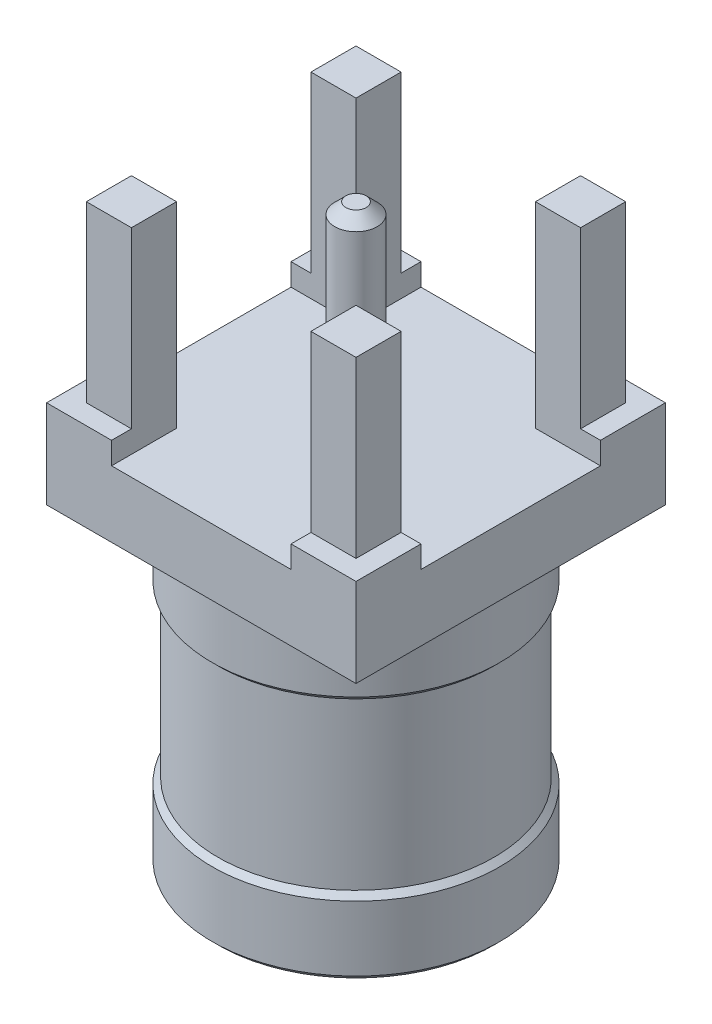
ISO-10303-21;
HEADER;
FILE_DESCRIPTION(('STEP AP214'),'2;1');
FILE_NAME('part.step','',(''),(''),'','','');
FILE_SCHEMA(('AUTOMOTIVE_DESIGN { 1 0 10303 214 1 1 1 1 }'));
ENDSEC;
DATA;
#1=APPLICATION_CONTEXT('core data for automotive mechanical design processes');
#2=APPLICATION_PROTOCOL_DEFINITION('international standard','automotive_design',2000,#1);
#3=PRODUCT_CONTEXT('',#1,'mechanical');
#4=PRODUCT('Part','Part','',(#3));
#5=PRODUCT_RELATED_PRODUCT_CATEGORY('part','',(#4));
#6=PRODUCT_DEFINITION_FORMATION('','',#4);
#7=PRODUCT_DEFINITION_CONTEXT('part definition',#1,'design');
#8=PRODUCT_DEFINITION('design','',#6,#7);
#9=PRODUCT_DEFINITION_SHAPE('','',#8);
#10=(LENGTH_UNIT() NAMED_UNIT(*) SI_UNIT(.MILLI.,.METRE.));
#11=(NAMED_UNIT(*) PLANE_ANGLE_UNIT() SI_UNIT($,.RADIAN.));
#12=(NAMED_UNIT(*) SI_UNIT($,.STERADIAN.) SOLID_ANGLE_UNIT());
#13=UNCERTAINTY_MEASURE_WITH_UNIT(LENGTH_MEASURE(1.E-05),#10,'distance_accuracy_value','');
#14=(GEOMETRIC_REPRESENTATION_CONTEXT(3) GLOBAL_UNCERTAINTY_ASSIGNED_CONTEXT((#13)) GLOBAL_UNIT_ASSIGNED_CONTEXT((#10,
#11,#12)) REPRESENTATION_CONTEXT('',''));
#15=CARTESIAN_POINT('',(0.,0.,0.));
#16=DIRECTION('',(0.,0.,1.));
#17=DIRECTION('',(1.,0.,0.));
#18=AXIS2_PLACEMENT_3D('',#15,#16,#17);
#19=CARTESIAN_POINT('',(0.,-25.3123881554251,0.));
#20=DIRECTION('',(0.,1.,0.));
#21=DIRECTION('',(0.,0.,1.));
#22=AXIS2_PLACEMENT_3D('',#19,#20,#21);
#23=CYLINDRICAL_SURFACE('',#22,3.25);
#24=CARTESIAN_POINT('',(0.,-1.4675,0.));
#25=DIRECTION('',(0.,-1.,0.));
#26=DIRECTION('',(0.,0.,-1.));
#27=AXIS2_PLACEMENT_3D('',#24,#25,#26);
#28=CIRCLE('',#27,3.25);
#29=CARTESIAN_POINT('',(0.,-1.4675,-3.25));
#30=VERTEX_POINT('',#29);
#31=EDGE_CURVE('E1028',#30,#30,#28,.T.);
#32=ORIENTED_EDGE('',*,*,#31,.F.);
#33=EDGE_LOOP('',(#32));
#34=FACE_BOUND('',#33,.T.);
#35=CARTESIAN_POINT('',(0.,-0.125000000000002,0.));
#36=DIRECTION('',(0.,-1.,0.));
#37=DIRECTION('',(0.,0.,-1.));
#38=AXIS2_PLACEMENT_3D('',#35,#36,#37);
#39=CIRCLE('',#38,3.25);
#40=CARTESIAN_POINT('',(0.,-0.125000000000002,-3.25));
#41=VERTEX_POINT('',#40);
#42=EDGE_CURVE('E1011',#41,#41,#39,.T.);
#43=ORIENTED_EDGE('',*,*,#42,.T.);
#44=EDGE_LOOP('',(#43));
#45=FACE_BOUND('',#44,.T.);
#46=ADVANCED_FACE('F40',(#34,#45),#23,.T.);
#47=CARTESIAN_POINT('',(0.,-6.935,0.));
#48=DIRECTION('',(0.,-1.,0.));
#49=DIRECTION('',(0.,0.,-1.));
#50=AXIS2_PLACEMENT_3D('',#47,#48,#49);
#51=CIRCLE('',#50,3.25);
#52=CARTESIAN_POINT('',(0.,-6.935,-3.25));
#53=VERTEX_POINT('',#52);
#54=EDGE_CURVE('E519',#53,#53,#51,.F.);
#55=ORIENTED_EDGE('',*,*,#54,.T.);
#56=EDGE_LOOP('',(#55));
#57=FACE_BOUND('',#56,.T.);
#58=CARTESIAN_POINT('',(0.,-5.4675,0.));
#59=DIRECTION('',(0.,-1.,0.));
#60=DIRECTION('',(0.,0.,-1.));
#61=AXIS2_PLACEMENT_3D('',#58,#59,#60);
#62=CIRCLE('',#61,3.25);
#63=CARTESIAN_POINT('',(0.,-5.4675,-3.25));
#64=VERTEX_POINT('',#63);
#65=EDGE_CURVE('E1016',#64,#64,#62,.T.);
#66=ORIENTED_EDGE('',*,*,#65,.T.);
#67=EDGE_LOOP('',(#66));
#68=FACE_BOUND('',#67,.T.);
#69=ADVANCED_FACE('F540',(#57,#68),#23,.T.);
#70=CARTESIAN_POINT('',(0.,-25.3123881554251,0.));
#71=DIRECTION('',(0.,1.,0.));
#72=DIRECTION('',(0.,0.,1.));
#73=AXIS2_PLACEMENT_3D('',#70,#71,#72);
#74=CYLINDRICAL_SURFACE('',#73,1.6);
#75=CARTESIAN_POINT('',(0.,-6.935,0.));
#76=DIRECTION('',(0.,-1.,0.));
#77=DIRECTION('',(0.,0.,-1.));
#78=AXIS2_PLACEMENT_3D('',#75,#76,#77);
#79=CIRCLE('',#78,1.6);
#80=CARTESIAN_POINT('',(0.,-6.935,-1.6));
#81=VERTEX_POINT('',#80);
#82=EDGE_CURVE('E506',#81,#81,#79,.T.);
#83=ORIENTED_EDGE('',*,*,#82,.T.);
#84=EDGE_LOOP('',(#83));
#85=FACE_BOUND('',#84,.T.);
#86=CARTESIAN_POINT('',(0.,0.,0.));
#87=DIRECTION('',(0.,-1.,0.));
#88=DIRECTION('',(0.,0.,-1.));
#89=AXIS2_PLACEMENT_3D('',#86,#87,#88);
#90=CIRCLE('',#89,1.6);
#91=CARTESIAN_POINT('',(0.,0.,-1.6));
#92=VERTEX_POINT('',#91);
#93=EDGE_CURVE('E437',#92,#92,#90,.F.);
#94=ORIENTED_EDGE('',*,*,#93,.T.);
#95=EDGE_LOOP('',(#94));
#96=FACE_BOUND('',#95,.T.);
#97=ADVANCED_FACE('F547',(#85,#96),#74,.F.);
#98=CARTESIAN_POINT('',(0.,-7.06,0.));
#99=DIRECTION('',(0.,-1.,0.));
#100=DIRECTION('',(0.,0.,-1.));
#101=AXIS2_PLACEMENT_3D('',#98,#99,#100);
#102=PLANE('',#101);
#103=CARTESIAN_POINT('',(0.,-7.06,0.));
#104=DIRECTION('',(0.,-1.,0.));
#105=DIRECTION('',(0.,0.,-1.));
#106=AXIS2_PLACEMENT_3D('',#103,#104,#105);
#107=CIRCLE('',#106,1.72500000000001);
#108=CARTESIAN_POINT('',(0.,-7.06,-1.72500000000001));
#109=VERTEX_POINT('',#108);
#110=EDGE_CURVE('E514',#109,#109,#107,.F.);
#111=ORIENTED_EDGE('',*,*,#110,.T.);
#112=EDGE_LOOP('',(#111));
#113=FACE_BOUND('',#112,.T.);
#114=CARTESIAN_POINT('',(0.,-7.06,0.));
#115=DIRECTION('',(0.,-1.,0.));
#116=DIRECTION('',(0.,0.,-1.));
#117=AXIS2_PLACEMENT_3D('',#114,#115,#116);
#118=CIRCLE('',#117,3.125);
#119=CARTESIAN_POINT('',(0.,-7.06,-3.125));
#120=VERTEX_POINT('',#119);
#121=EDGE_CURVE('E510',#120,#120,#118,.T.);
#122=ORIENTED_EDGE('',*,*,#121,.T.);
#123=EDGE_LOOP('',(#122));
#124=FACE_BOUND('',#123,.T.);
#125=ADVANCED_FACE('F671',(#113,#124),#102,.T.);
#126=CARTESIAN_POINT('',(0.,0.,0.));
#127=DIRECTION('',(0.,-1.,0.));
#128=DIRECTION('',(0.,0.,-1.));
#129=AXIS2_PLACEMENT_3D('',#126,#127,#128);
#130=PLANE('',#129);
#131=ORIENTED_EDGE('',*,*,#93,.F.);
#132=EDGE_LOOP('',(#131));
#133=FACE_BOUND('',#132,.T.);
#134=ADVANCED_FACE('F645',(#133),#130,.T.);
#135=CARTESIAN_POINT('',(0.,-6.935,0.));
#136=DIRECTION('',(0.,-1.,0.));
#137=DIRECTION('',(0.,0.,-1.));
#138=AXIS2_PLACEMENT_3D('',#135,#136,#137);
#139=CONICAL_SURFACE('',#138,1.6,0.785398163397458);
#140=ORIENTED_EDGE('',*,*,#110,.F.);
#141=EDGE_LOOP('',(#140));
#142=FACE_BOUND('',#141,.T.);
#143=ORIENTED_EDGE('',*,*,#82,.F.);
#144=EDGE_LOOP('',(#143));
#145=FACE_BOUND('',#144,.T.);
#146=ADVANCED_FACE('F654',(#142,#145),#139,.F.);
#147=CARTESIAN_POINT('',(0.,-7.06,0.));
#148=DIRECTION('',(0.,1.,0.));
#149=DIRECTION('',(0.,0.,1.));
#150=AXIS2_PLACEMENT_3D('',#147,#148,#149);
#151=CONICAL_SURFACE('',#150,3.125,0.785398163397445);
#152=ORIENTED_EDGE('',*,*,#54,.F.);
#153=EDGE_LOOP('',(#152));
#154=FACE_BOUND('',#153,.T.);
#155=ORIENTED_EDGE('',*,*,#121,.F.);
#156=EDGE_LOOP('',(#155));
#157=FACE_BOUND('',#156,.T.);
#158=ADVANCED_FACE('F656',(#154,#157),#151,.T.);
#159=CARTESIAN_POINT('',(0.,-1.5925,0.));
#160=DIRECTION('',(0.,1.,0.));
#161=DIRECTION('',(0.,0.,1.));
#162=AXIS2_PLACEMENT_3D('',#159,#160,#161);
#163=CONICAL_SURFACE('',#162,3.125,0.785398163397459);
#164=ORIENTED_EDGE('',*,*,#31,.T.);
#165=EDGE_LOOP('',(#164));
#166=FACE_BOUND('',#165,.T.);
#167=CARTESIAN_POINT('',(0.,-1.5925,0.));
#168=DIRECTION('',(0.,-1.,0.));
#169=DIRECTION('',(0.,0.,-1.));
#170=AXIS2_PLACEMENT_3D('',#167,#168,#169);
#171=CIRCLE('',#170,3.125);
#172=CARTESIAN_POINT('',(0.,-1.5925,-3.125));
#173=VERTEX_POINT('',#172);
#174=EDGE_CURVE('E1024',#173,#173,#171,.T.);
#175=ORIENTED_EDGE('',*,*,#174,.F.);
#176=EDGE_LOOP('',(#175));
#177=FACE_BOUND('',#176,.T.);
#178=ADVANCED_FACE('F659',(#166,#177),#163,.T.);
#179=CARTESIAN_POINT('',(0.,-6.81,0.));
#180=DIRECTION('',(0.,-1.,0.));
#181=DIRECTION('',(0.,0.,-1.));
#182=AXIS2_PLACEMENT_3D('',#179,#180,#181);
#183=CYLINDRICAL_SURFACE('',#182,3.125);
#184=ORIENTED_EDGE('',*,*,#174,.T.);
#185=EDGE_LOOP('',(#184));
#186=FACE_BOUND('',#185,.T.);
#187=CARTESIAN_POINT('',(0.,-5.3425,0.));
#188=DIRECTION('',(0.,-1.,0.));
#189=DIRECTION('',(0.,0.,-1.));
#190=AXIS2_PLACEMENT_3D('',#187,#188,#189);
#191=CIRCLE('',#190,3.125);
#192=CARTESIAN_POINT('',(0.,-5.3425,-3.125));
#193=VERTEX_POINT('',#192);
#194=EDGE_CURVE('E1021',#193,#193,#191,.T.);
#195=ORIENTED_EDGE('',*,*,#194,.F.);
#196=EDGE_LOOP('',(#195));
#197=FACE_BOUND('',#196,.T.);
#198=ADVANCED_FACE('F664',(#186,#197),#183,.T.);
#199=CARTESIAN_POINT('',(0.,-5.4675,0.));
#200=DIRECTION('',(0.,-1.,0.));
#201=DIRECTION('',(0.,0.,-1.));
#202=AXIS2_PLACEMENT_3D('',#199,#200,#201);
#203=CONICAL_SURFACE('',#202,3.25,0.785398163397434);
#204=ORIENTED_EDGE('',*,*,#194,.T.);
#205=EDGE_LOOP('',(#204));
#206=FACE_BOUND('',#205,.T.);
#207=ORIENTED_EDGE('',*,*,#65,.F.);
#208=EDGE_LOOP('',(#207));
#209=FACE_BOUND('',#208,.T.);
#210=ADVANCED_FACE('F682',(#206,#209),#203,.T.);
#211=CARTESIAN_POINT('',(0.,-0.125000000000002,0.));
#212=DIRECTION('',(0.,-1.,0.));
#213=DIRECTION('',(0.,0.,-1.));
#214=AXIS2_PLACEMENT_3D('',#211,#212,#213);
#215=CONICAL_SURFACE('',#214,3.25,0.785398163397442);
#216=CARTESIAN_POINT('',(0.,0.,0.));
#217=DIRECTION('',(0.,-1.,0.));
#218=DIRECTION('',(0.,0.,-1.));
#219=AXIS2_PLACEMENT_3D('',#216,#217,#218);
#220=CIRCLE('',#219,3.125);
#221=CARTESIAN_POINT('',(0.,0.,-3.125));
#222=VERTEX_POINT('',#221);
#223=EDGE_CURVE('E1008',#222,#222,#220,.T.);
#224=ORIENTED_EDGE('',*,*,#223,.T.);
#225=EDGE_LOOP('',(#224));
#226=FACE_BOUND('',#225,.T.);
#227=ORIENTED_EDGE('',*,*,#42,.F.);
#228=EDGE_LOOP('',(#227));
#229=FACE_BOUND('',#228,.T.);
#230=ADVANCED_FACE('F563',(#226,#229),#215,.T.);
#231=CARTESIAN_POINT('',(-2.03,5.94,-3.05));
#232=DIRECTION('',(0.,0.,1.));
#233=DIRECTION('',(1.,0.,0.));
#234=AXIS2_PLACEMENT_3D('',#231,#232,#233);
#235=PLANE('',#234);
#236=DIRECTION('',(-1.,0.,0.));
#237=VECTOR('',#236,1.);
#238=CARTESIAN_POINT('',(-2.03,2.,-3.05));
#239=LINE('',#238,#237);
#240=CARTESIAN_POINT('',(-2.03,2.,-3.05));
#241=VERTEX_POINT('',#240);
#242=CARTESIAN_POINT('',(-3.05,2.,-3.05));
#243=VERTEX_POINT('',#242);
#244=EDGE_CURVE('E59',#241,#243,#239,.T.);
#245=ORIENTED_EDGE('',*,*,#244,.T.);
#246=DIRECTION('',(0.,-1.,0.));
#247=VECTOR('',#246,1.);
#248=CARTESIAN_POINT('',(-3.05,5.94,-3.05));
#249=LINE('',#248,#247);
#250=CARTESIAN_POINT('',(-3.05,5.94,-3.05));
#251=VERTEX_POINT('',#250);
#252=EDGE_CURVE('E231',#251,#243,#249,.T.);
#253=ORIENTED_EDGE('',*,*,#252,.F.);
#254=DIRECTION('',(-1.,0.,0.));
#255=VECTOR('',#254,1.);
#256=CARTESIAN_POINT('',(-2.03,5.94,-3.05));
#257=LINE('',#256,#255);
#258=CARTESIAN_POINT('',(-2.03,5.94,-3.05));
#259=VERTEX_POINT('',#258);
#260=EDGE_CURVE('E225',#259,#251,#257,.T.);
#261=ORIENTED_EDGE('',*,*,#260,.F.);
#262=DIRECTION('',(0.,-1.,0.));
#263=VECTOR('',#262,1.);
#264=CARTESIAN_POINT('',(-2.03,5.94,-3.05));
#265=LINE('',#264,#263);
#266=EDGE_CURVE('E229',#259,#241,#265,.T.);
#267=ORIENTED_EDGE('',*,*,#266,.T.);
#268=EDGE_LOOP('',(#245,#253,#261,#267));
#269=FACE_BOUND('',#268,.T.);
#270=ADVANCED_FACE('F227',(#269),#235,.F.);
#271=CARTESIAN_POINT('',(-3.05,5.94,-2.03));
#272=DIRECTION('',(1.,0.,0.));
#273=DIRECTION('',(0.,0.,-1.));
#274=AXIS2_PLACEMENT_3D('',#271,#272,#273);
#275=PLANE('',#274);
#276=DIRECTION('',(0.,0.,1.));
#277=VECTOR('',#276,1.);
#278=CARTESIAN_POINT('',(-3.05,2.,-2.03));
#279=LINE('',#278,#277);
#280=CARTESIAN_POINT('',(-3.05,2.,-2.03));
#281=VERTEX_POINT('',#280);
#282=EDGE_CURVE('E55',#243,#281,#279,.T.);
#283=ORIENTED_EDGE('',*,*,#282,.T.);
#284=DIRECTION('',(0.,-1.,0.));
#285=VECTOR('',#284,1.);
#286=CARTESIAN_POINT('',(-3.05,5.94,-2.03));
#287=LINE('',#286,#285);
#288=CARTESIAN_POINT('',(-3.05,5.94,-2.03));
#289=VERTEX_POINT('',#288);
#290=EDGE_CURVE('E254',#289,#281,#287,.T.);
#291=ORIENTED_EDGE('',*,*,#290,.F.);
#292=DIRECTION('',(0.,0.,1.));
#293=VECTOR('',#292,1.);
#294=CARTESIAN_POINT('',(-3.05,5.94,-2.03));
#295=LINE('',#294,#293);
#296=EDGE_CURVE('E234',#251,#289,#295,.T.);
#297=ORIENTED_EDGE('',*,*,#296,.F.);
#298=ORIENTED_EDGE('',*,*,#252,.T.);
#299=EDGE_LOOP('',(#283,#291,#297,#298));
#300=FACE_BOUND('',#299,.T.);
#301=ADVANCED_FACE('F557',(#300),#275,.F.);
#302=CARTESIAN_POINT('',(0.,5.94,0.));
#303=DIRECTION('',(0.,1.,0.));
#304=DIRECTION('',(0.,0.,1.));
#305=AXIS2_PLACEMENT_3D('',#302,#303,#304);
#306=PLANE('',#305);
#307=DIRECTION('',(0.,0.,-1.));
#308=VECTOR('',#307,1.);
#309=CARTESIAN_POINT('',(-2.03,5.94,-2.03));
#310=LINE('',#309,#308);
#311=CARTESIAN_POINT('',(-2.03,5.94,-2.03));
#312=VERTEX_POINT('',#311);
#313=EDGE_CURVE('E235',#312,#259,#310,.T.);
#314=ORIENTED_EDGE('',*,*,#313,.T.);
#315=ORIENTED_EDGE('',*,*,#260,.T.);
#316=ORIENTED_EDGE('',*,*,#296,.T.);
#317=DIRECTION('',(1.,0.,0.));
#318=VECTOR('',#317,1.);
#319=CARTESIAN_POINT('',(-2.03,5.94,-2.03));
#320=LINE('',#319,#318);
#321=EDGE_CURVE('E241',#289,#312,#320,.T.);
#322=ORIENTED_EDGE('',*,*,#321,.T.);
#323=EDGE_LOOP('',(#314,#315,#316,#322));
#324=FACE_BOUND('',#323,.T.);
#325=ADVANCED_FACE('F239',(#324),#306,.T.);
#326=CARTESIAN_POINT('',(-3.05,5.94,2.03));
#327=DIRECTION('',(1.,0.,0.));
#328=DIRECTION('',(0.,0.,-1.));
#329=AXIS2_PLACEMENT_3D('',#326,#327,#328);
#330=PLANE('',#329);
#331=DIRECTION('',(0.,0.,1.));
#332=VECTOR('',#331,1.);
#333=CARTESIAN_POINT('',(-3.05,2.,2.03));
#334=LINE('',#333,#332);
#335=CARTESIAN_POINT('',(-3.05,2.,2.03));
#336=VERTEX_POINT('',#335);
#337=CARTESIAN_POINT('',(-3.05,2.,3.05));
#338=VERTEX_POINT('',#337);
#339=EDGE_CURVE('E309',#336,#338,#334,.T.);
#340=ORIENTED_EDGE('',*,*,#339,.T.);
#341=DIRECTION('',(0.,-1.,0.));
#342=VECTOR('',#341,1.);
#343=CARTESIAN_POINT('',(-3.05,5.94,3.05));
#344=LINE('',#343,#342);
#345=CARTESIAN_POINT('',(-3.05,5.94,3.05));
#346=VERTEX_POINT('',#345);
#347=EDGE_CURVE('E327',#346,#338,#344,.T.);
#348=ORIENTED_EDGE('',*,*,#347,.F.);
#349=DIRECTION('',(0.,0.,1.));
#350=VECTOR('',#349,1.);
#351=CARTESIAN_POINT('',(-3.05,5.94,2.03));
#352=LINE('',#351,#350);
#353=CARTESIAN_POINT('',(-3.05,5.94,2.03));
#354=VERTEX_POINT('',#353);
#355=EDGE_CURVE('E316',#354,#346,#352,.T.);
#356=ORIENTED_EDGE('',*,*,#355,.F.);
#357=DIRECTION('',(0.,-1.,0.));
#358=VECTOR('',#357,1.);
#359=CARTESIAN_POINT('',(-3.05,5.94,2.03));
#360=LINE('',#359,#358);
#361=EDGE_CURVE('E330',#354,#336,#360,.T.);
#362=ORIENTED_EDGE('',*,*,#361,.T.);
#363=EDGE_LOOP('',(#340,#348,#356,#362));
#364=FACE_BOUND('',#363,.T.);
#365=ADVANCED_FACE('F556',(#364),#330,.F.);
#366=CARTESIAN_POINT('',(-2.03,5.94,3.05));
#367=DIRECTION('',(0.,0.,-1.));
#368=DIRECTION('',(-1.,0.,0.));
#369=AXIS2_PLACEMENT_3D('',#366,#367,#368);
#370=PLANE('',#369);
#371=DIRECTION('',(1.,0.,0.));
#372=VECTOR('',#371,1.);
#373=CARTESIAN_POINT('',(-2.03,2.,3.05));
#374=LINE('',#373,#372);
#375=CARTESIAN_POINT('',(-2.03,2.,3.05));
#376=VERTEX_POINT('',#375);
#377=EDGE_CURVE('E314',#338,#376,#374,.T.);
#378=ORIENTED_EDGE('',*,*,#377,.T.);
#379=DIRECTION('',(0.,-1.,0.));
#380=VECTOR('',#379,1.);
#381=CARTESIAN_POINT('',(-2.03,5.94,3.05));
#382=LINE('',#381,#380);
#383=CARTESIAN_POINT('',(-2.03,5.94,3.05));
#384=VERTEX_POINT('',#383);
#385=EDGE_CURVE('E320',#384,#376,#382,.T.);
#386=ORIENTED_EDGE('',*,*,#385,.F.);
#387=DIRECTION('',(1.,0.,0.));
#388=VECTOR('',#387,1.);
#389=CARTESIAN_POINT('',(-2.03,5.94,3.05));
#390=LINE('',#389,#388);
#391=EDGE_CURVE('E318',#346,#384,#390,.T.);
#392=ORIENTED_EDGE('',*,*,#391,.F.);
#393=ORIENTED_EDGE('',*,*,#347,.T.);
#394=EDGE_LOOP('',(#378,#386,#392,#393));
#395=FACE_BOUND('',#394,.T.);
#396=ADVANCED_FACE('F592',(#395),#370,.F.);
#397=CARTESIAN_POINT('',(0.,5.94,0.));
#398=DIRECTION('',(0.,-1.,0.));
#399=DIRECTION('',(0.,0.,-1.));
#400=AXIS2_PLACEMENT_3D('',#397,#398,#399);
#401=PLANE('',#400);
#402=DIRECTION('',(0.,0.,-1.));
#403=VECTOR('',#402,1.);
#404=CARTESIAN_POINT('',(-2.03,5.94,2.03));
#405=LINE('',#404,#403);
#406=CARTESIAN_POINT('',(-2.03,5.94,2.03));
#407=VERTEX_POINT('',#406);
#408=EDGE_CURVE('E310',#384,#407,#405,.T.);
#409=ORIENTED_EDGE('',*,*,#408,.T.);
#410=DIRECTION('',(-1.,0.,0.));
#411=VECTOR('',#410,1.);
#412=CARTESIAN_POINT('',(-2.03,5.94,2.03));
#413=LINE('',#412,#411);
#414=EDGE_CURVE('E313',#407,#354,#413,.T.);
#415=ORIENTED_EDGE('',*,*,#414,.T.);
#416=ORIENTED_EDGE('',*,*,#355,.T.);
#417=ORIENTED_EDGE('',*,*,#391,.T.);
#418=EDGE_LOOP('',(#409,#415,#416,#417));
#419=FACE_BOUND('',#418,.T.);
#420=ADVANCED_FACE('F588',(#419),#401,.F.);
#421=CARTESIAN_POINT('',(2.03,5.94,3.05));
#422=DIRECTION('',(0.,0.,-1.));
#423=DIRECTION('',(-1.,0.,0.));
#424=AXIS2_PLACEMENT_3D('',#421,#422,#423);
#425=PLANE('',#424);
#426=DIRECTION('',(1.,0.,0.));
#427=VECTOR('',#426,1.);
#428=CARTESIAN_POINT('',(2.03,2.,3.05));
#429=LINE('',#428,#427);
#430=CARTESIAN_POINT('',(2.03,2.,3.05));
#431=VERTEX_POINT('',#430);
#432=CARTESIAN_POINT('',(3.05,2.,3.05));
#433=VERTEX_POINT('',#432);
#434=EDGE_CURVE('E278',#431,#433,#429,.T.);
#435=ORIENTED_EDGE('',*,*,#434,.T.);
#436=DIRECTION('',(0.,-1.,0.));
#437=VECTOR('',#436,1.);
#438=CARTESIAN_POINT('',(3.05,5.94,3.05));
#439=LINE('',#438,#437);
#440=CARTESIAN_POINT('',(3.05,5.94,3.05));
#441=VERTEX_POINT('',#440);
#442=EDGE_CURVE('E302',#441,#433,#439,.T.);
#443=ORIENTED_EDGE('',*,*,#442,.F.);
#444=DIRECTION('',(1.,0.,0.));
#445=VECTOR('',#444,1.);
#446=CARTESIAN_POINT('',(2.03,5.94,3.05));
#447=LINE('',#446,#445);
#448=CARTESIAN_POINT('',(2.03,5.94,3.05));
#449=VERTEX_POINT('',#448);
#450=EDGE_CURVE('E283',#449,#441,#447,.T.);
#451=ORIENTED_EDGE('',*,*,#450,.F.);
#452=DIRECTION('',(0.,-1.,0.));
#453=VECTOR('',#452,1.);
#454=CARTESIAN_POINT('',(2.03,5.94,3.05));
#455=LINE('',#454,#453);
#456=EDGE_CURVE('E305',#449,#431,#455,.T.);
#457=ORIENTED_EDGE('',*,*,#456,.T.);
#458=EDGE_LOOP('',(#435,#443,#451,#457));
#459=FACE_BOUND('',#458,.T.);
#460=ADVANCED_FACE('F584',(#459),#425,.F.);
#461=CARTESIAN_POINT('',(3.05,5.94,2.03));
#462=DIRECTION('',(-1.,0.,0.));
#463=DIRECTION('',(0.,0.,1.));
#464=AXIS2_PLACEMENT_3D('',#461,#462,#463);
#465=PLANE('',#464);
#466=DIRECTION('',(0.,0.,-1.));
#467=VECTOR('',#466,1.);
#468=CARTESIAN_POINT('',(3.05,2.,2.03));
#469=LINE('',#468,#467);
#470=CARTESIAN_POINT('',(3.05,2.,2.03));
#471=VERTEX_POINT('',#470);
#472=EDGE_CURVE('E284',#433,#471,#469,.T.);
#473=ORIENTED_EDGE('',*,*,#472,.T.);
#474=DIRECTION('',(0.,-1.,0.));
#475=VECTOR('',#474,1.);
#476=CARTESIAN_POINT('',(3.05,5.94,2.03));
#477=LINE('',#476,#475);
#478=CARTESIAN_POINT('',(3.05,5.94,2.03));
#479=VERTEX_POINT('',#478);
#480=EDGE_CURVE('E294',#479,#471,#477,.T.);
#481=ORIENTED_EDGE('',*,*,#480,.F.);
#482=DIRECTION('',(0.,0.,-1.));
#483=VECTOR('',#482,1.);
#484=CARTESIAN_POINT('',(3.05,5.94,2.03));
#485=LINE('',#484,#483);
#486=EDGE_CURVE('E287',#441,#479,#485,.T.);
#487=ORIENTED_EDGE('',*,*,#486,.F.);
#488=ORIENTED_EDGE('',*,*,#442,.T.);
#489=EDGE_LOOP('',(#473,#481,#487,#488));
#490=FACE_BOUND('',#489,.T.);
#491=ADVANCED_FACE('F580',(#490),#465,.F.);
#492=CARTESIAN_POINT('',(0.,5.94,0.));
#493=DIRECTION('',(0.,1.,0.));
#494=DIRECTION('',(0.,0.,1.));
#495=AXIS2_PLACEMENT_3D('',#492,#493,#494);
#496=PLANE('',#495);
#497=DIRECTION('',(0.,0.,1.));
#498=VECTOR('',#497,1.);
#499=CARTESIAN_POINT('',(2.03,5.94,2.03));
#500=LINE('',#499,#498);
#501=CARTESIAN_POINT('',(2.03,5.94,2.03));
#502=VERTEX_POINT('',#501);
#503=EDGE_CURVE('E279',#502,#449,#500,.T.);
#504=ORIENTED_EDGE('',*,*,#503,.T.);
#505=ORIENTED_EDGE('',*,*,#450,.T.);
#506=ORIENTED_EDGE('',*,*,#486,.T.);
#507=DIRECTION('',(-1.,0.,0.));
#508=VECTOR('',#507,1.);
#509=CARTESIAN_POINT('',(2.03,5.94,2.03));
#510=LINE('',#509,#508);
#511=EDGE_CURVE('E290',#479,#502,#510,.T.);
#512=ORIENTED_EDGE('',*,*,#511,.T.);
#513=EDGE_LOOP('',(#504,#505,#506,#512));
#514=FACE_BOUND('',#513,.T.);
#515=ADVANCED_FACE('F568',(#514),#496,.T.);
#516=CARTESIAN_POINT('',(0.,5.94,0.));
#517=DIRECTION('',(0.,-1.,0.));
#518=DIRECTION('',(0.,0.,-1.));
#519=AXIS2_PLACEMENT_3D('',#516,#517,#518);
#520=PLANE('',#519);
#521=DIRECTION('',(0.,0.,1.));
#522=VECTOR('',#521,1.);
#523=CARTESIAN_POINT('',(2.03,5.94,-2.03));
#524=LINE('',#523,#522);
#525=CARTESIAN_POINT('',(2.03,5.94,-3.05));
#526=VERTEX_POINT('',#525);
#527=CARTESIAN_POINT('',(2.03,5.94,-2.03));
#528=VERTEX_POINT('',#527);
#529=EDGE_CURVE('E258',#526,#528,#524,.T.);
#530=ORIENTED_EDGE('',*,*,#529,.T.);
#531=DIRECTION('',(1.,0.,0.));
#532=VECTOR('',#531,1.);
#533=CARTESIAN_POINT('',(2.03,5.94,-2.03));
#534=LINE('',#533,#532);
#535=CARTESIAN_POINT('',(3.05,5.94,-2.03));
#536=VERTEX_POINT('',#535);
#537=EDGE_CURVE('E261',#528,#536,#534,.T.);
#538=ORIENTED_EDGE('',*,*,#537,.T.);
#539=DIRECTION('',(0.,0.,-1.));
#540=VECTOR('',#539,1.);
#541=CARTESIAN_POINT('',(3.05,5.94,-2.03));
#542=LINE('',#541,#540);
#543=CARTESIAN_POINT('',(3.05,5.94,-3.05));
#544=VERTEX_POINT('',#543);
#545=EDGE_CURVE('E263',#536,#544,#542,.T.);
#546=ORIENTED_EDGE('',*,*,#545,.T.);
#547=DIRECTION('',(-1.,0.,0.));
#548=VECTOR('',#547,1.);
#549=CARTESIAN_POINT('',(2.03,5.94,-3.05));
#550=LINE('',#549,#548);
#551=EDGE_CURVE('E265',#544,#526,#550,.T.);
#552=ORIENTED_EDGE('',*,*,#551,.T.);
#553=EDGE_LOOP('',(#530,#538,#546,#552));
#554=FACE_BOUND('',#553,.T.);
#555=ADVANCED_FACE('F564',(#554),#520,.F.);
#556=CARTESIAN_POINT('',(2.03,5.94,-3.05));
#557=DIRECTION('',(0.,0.,1.));
#558=DIRECTION('',(1.,0.,0.));
#559=AXIS2_PLACEMENT_3D('',#556,#557,#558);
#560=PLANE('',#559);
#561=DIRECTION('',(-1.,0.,0.));
#562=VECTOR('',#561,1.);
#563=CARTESIAN_POINT('',(2.03,2.,-3.05));
#564=LINE('',#563,#562);
#565=CARTESIAN_POINT('',(3.05,2.,-3.05));
#566=VERTEX_POINT('',#565);
#567=CARTESIAN_POINT('',(2.03,2.,-3.05));
#568=VERTEX_POINT('',#567);
#569=EDGE_CURVE('E252',#566,#568,#564,.T.);
#570=ORIENTED_EDGE('',*,*,#569,.T.);
#571=DIRECTION('',(0.,-1.,0.));
#572=VECTOR('',#571,1.);
#573=CARTESIAN_POINT('',(2.03,5.94,-3.05));
#574=LINE('',#573,#572);
#575=EDGE_CURVE('E266',#526,#568,#574,.T.);
#576=ORIENTED_EDGE('',*,*,#575,.F.);
#577=ORIENTED_EDGE('',*,*,#551,.F.);
#578=DIRECTION('',(0.,-1.,0.));
#579=VECTOR('',#578,1.);
#580=CARTESIAN_POINT('',(3.05,5.94,-3.05));
#581=LINE('',#580,#579);
#582=EDGE_CURVE('E272',#544,#566,#581,.T.);
#583=ORIENTED_EDGE('',*,*,#582,.T.);
#584=EDGE_LOOP('',(#570,#576,#577,#583));
#585=FACE_BOUND('',#584,.T.);
#586=ADVANCED_FACE('F567',(#585),#560,.F.);
#587=CARTESIAN_POINT('',(3.05,5.94,-2.03));
#588=DIRECTION('',(-1.,0.,0.));
#589=DIRECTION('',(0.,0.,1.));
#590=AXIS2_PLACEMENT_3D('',#587,#588,#589);
#591=PLANE('',#590);
#592=DIRECTION('',(0.,0.,-1.));
#593=VECTOR('',#592,1.);
#594=CARTESIAN_POINT('',(3.05,2.,-2.03));
#595=LINE('',#594,#593);
#596=CARTESIAN_POINT('',(3.05,2.,-2.03));
#597=VERTEX_POINT('',#596);
#598=EDGE_CURVE('E249',#597,#566,#595,.T.);
#599=ORIENTED_EDGE('',*,*,#598,.T.);
#600=ORIENTED_EDGE('',*,*,#582,.F.);
#601=ORIENTED_EDGE('',*,*,#545,.F.);
#602=DIRECTION('',(0.,-1.,0.));
#603=VECTOR('',#602,1.);
#604=CARTESIAN_POINT('',(3.05,5.94,-2.03));
#605=LINE('',#604,#603);
#606=EDGE_CURVE('E275',#536,#597,#605,.T.);
#607=ORIENTED_EDGE('',*,*,#606,.T.);
#608=EDGE_LOOP('',(#599,#600,#601,#607));
#609=FACE_BOUND('',#608,.T.);
#610=ADVANCED_FACE('F572',(#609),#591,.F.);
#611=CARTESIAN_POINT('',(2.03,2.,-3.5));
#612=DIRECTION('',(1.,0.,0.));
#613=DIRECTION('',(0.,0.,-1.));
#614=AXIS2_PLACEMENT_3D('',#611,#612,#613);
#615=PLANE('',#614);
#616=DIRECTION('',(0.,0.,1.));
#617=VECTOR('',#616,1.);
#618=CARTESIAN_POINT('',(2.03,1.5,-3.5));
#619=LINE('',#618,#617);
#620=CARTESIAN_POINT('',(2.03,1.5,-3.5));
#621=VERTEX_POINT('',#620);
#622=CARTESIAN_POINT('',(2.03,1.5,-2.03));
#623=VERTEX_POINT('',#622);
#624=EDGE_CURVE('E383',#621,#623,#619,.T.);
#625=ORIENTED_EDGE('',*,*,#624,.T.);
#626=DIRECTION('',(0.,-1.,0.));
#627=VECTOR('',#626,1.);
#628=CARTESIAN_POINT('',(2.03,2.,-2.03));
#629=LINE('',#628,#627);
#630=EDGE_CURVE('E401',#528,#623,#629,.T.);
#631=ORIENTED_EDGE('',*,*,#630,.F.);
#632=ORIENTED_EDGE('',*,*,#529,.F.);
#633=ORIENTED_EDGE('',*,*,#575,.T.);
#634=DIRECTION('',(0.,0.,1.));
#635=VECTOR('',#634,1.);
#636=CARTESIAN_POINT('',(2.03,2.,-3.5));
#637=LINE('',#636,#635);
#638=CARTESIAN_POINT('',(2.03,2.,-3.5));
#639=VERTEX_POINT('',#638);
#640=EDGE_CURVE('E390',#639,#568,#637,.T.);
#641=ORIENTED_EDGE('',*,*,#640,.F.);
#642=DIRECTION('',(0.,-1.,0.));
#643=VECTOR('',#642,1.);
#644=CARTESIAN_POINT('',(2.03,2.,-3.5));
#645=LINE('',#644,#643);
#646=EDGE_CURVE('E404',#639,#621,#645,.T.);
#647=ORIENTED_EDGE('',*,*,#646,.T.);
#648=EDGE_LOOP('',(#625,#631,#632,#633,#641,#647));
#649=FACE_BOUND('',#648,.T.);
#650=ADVANCED_FACE('F576',(#649),#615,.F.);
#651=CARTESIAN_POINT('',(-2.03,2.,-3.5));
#652=DIRECTION('',(-1.,0.,0.));
#653=DIRECTION('',(0.,0.,1.));
#654=AXIS2_PLACEMENT_3D('',#651,#652,#653);
#655=PLANE('',#654);
#656=DIRECTION('',(0.,0.,-1.));
#657=VECTOR('',#656,1.);
#658=CARTESIAN_POINT('',(-2.03,1.5,-3.5));
#659=LINE('',#658,#657);
#660=CARTESIAN_POINT('',(-2.03,1.5,-2.03));
#661=VERTEX_POINT('',#660);
#662=CARTESIAN_POINT('',(-2.03,1.5,-3.5));
#663=VERTEX_POINT('',#662);
#664=EDGE_CURVE('E412',#661,#663,#659,.T.);
#665=ORIENTED_EDGE('',*,*,#664,.T.);
#666=DIRECTION('',(0.,-1.,0.));
#667=VECTOR('',#666,1.);
#668=CARTESIAN_POINT('',(-2.03,2.,-3.5));
#669=LINE('',#668,#667);
#670=CARTESIAN_POINT('',(-2.03,2.,-3.5));
#671=VERTEX_POINT('',#670);
#672=EDGE_CURVE('E418',#671,#663,#669,.T.);
#673=ORIENTED_EDGE('',*,*,#672,.F.);
#674=DIRECTION('',(0.,0.,-1.));
#675=VECTOR('',#674,1.);
#676=CARTESIAN_POINT('',(-2.03,2.,-3.5));
#677=LINE('',#676,#675);
#678=EDGE_CURVE('E248',#241,#671,#677,.T.);
#679=ORIENTED_EDGE('',*,*,#678,.F.);
#680=ORIENTED_EDGE('',*,*,#266,.F.);
#681=ORIENTED_EDGE('',*,*,#313,.F.);
#682=DIRECTION('',(0.,-1.,0.));
#683=VECTOR('',#682,1.);
#684=CARTESIAN_POINT('',(-2.03,2.,-2.03));
#685=LINE('',#684,#683);
#686=EDGE_CURVE('E421',#312,#661,#685,.T.);
#687=ORIENTED_EDGE('',*,*,#686,.T.);
#688=EDGE_LOOP('',(#665,#673,#679,#680,#681,#687));
#689=FACE_BOUND('',#688,.T.);
#690=ADVANCED_FACE('F246',(#689),#655,.F.);
#691=CARTESIAN_POINT('',(0.,2.,0.));
#692=DIRECTION('',(0.,1.,0.));
#693=DIRECTION('',(0.,0.,1.));
#694=AXIS2_PLACEMENT_3D('',#691,#692,#693);
#695=PLANE('',#694);
#696=ORIENTED_EDGE('',*,*,#282,.F.);
#697=ORIENTED_EDGE('',*,*,#244,.F.);
#698=ORIENTED_EDGE('',*,*,#678,.T.);
#699=DIRECTION('',(-1.,0.,0.));
#700=VECTOR('',#699,1.);
#701=CARTESIAN_POINT('',(-3.5,2.,-3.5));
#702=LINE('',#701,#700);
#703=CARTESIAN_POINT('',(-3.5,2.,-3.5));
#704=VERTEX_POINT('',#703);
#705=EDGE_CURVE('E415',#671,#704,#702,.T.);
#706=ORIENTED_EDGE('',*,*,#705,.T.);
#707=DIRECTION('',(0.,0.,1.));
#708=VECTOR('',#707,1.);
#709=CARTESIAN_POINT('',(-3.5,2.,-3.5));
#710=LINE('',#709,#708);
#711=CARTESIAN_POINT('',(-3.5,2.,-2.03));
#712=VERTEX_POINT('',#711);
#713=EDGE_CURVE('E408',#704,#712,#710,.T.);
#714=ORIENTED_EDGE('',*,*,#713,.T.);
#715=DIRECTION('',(1.,0.,0.));
#716=VECTOR('',#715,1.);
#717=CARTESIAN_POINT('',(-3.5,2.,-2.03));
#718=LINE('',#717,#716);
#719=EDGE_CURVE('E411',#712,#281,#718,.T.);
#720=ORIENTED_EDGE('',*,*,#719,.T.);
#721=EDGE_LOOP('',(#696,#697,#698,#706,#714,#720));
#722=FACE_BOUND('',#721,.T.);
#723=ADVANCED_FACE('F631',(#722),#695,.T.);
#724=CARTESIAN_POINT('',(-3.5,2.,-2.03));
#725=DIRECTION('',(0.,0.,-1.));
#726=DIRECTION('',(-1.,0.,0.));
#727=AXIS2_PLACEMENT_3D('',#724,#725,#726);
#728=PLANE('',#727);
#729=DIRECTION('',(1.,0.,0.));
#730=VECTOR('',#729,1.);
#731=CARTESIAN_POINT('',(-3.5,1.5,-2.03));
#732=LINE('',#731,#730);
#733=CARTESIAN_POINT('',(-3.5,1.5,-2.03));
#734=VERTEX_POINT('',#733);
#735=EDGE_CURVE('E407',#734,#661,#732,.T.);
#736=ORIENTED_EDGE('',*,*,#735,.T.);
#737=ORIENTED_EDGE('',*,*,#686,.F.);
#738=ORIENTED_EDGE('',*,*,#321,.F.);
#739=ORIENTED_EDGE('',*,*,#290,.T.);
#740=ORIENTED_EDGE('',*,*,#719,.F.);
#741=DIRECTION('',(0.,-1.,0.));
#742=VECTOR('',#741,1.);
#743=CARTESIAN_POINT('',(-3.5,2.,-2.03));
#744=LINE('',#743,#742);
#745=EDGE_CURVE('E453',#712,#734,#744,.T.);
#746=ORIENTED_EDGE('',*,*,#745,.T.);
#747=EDGE_LOOP('',(#736,#737,#738,#739,#740,#746));
#748=FACE_BOUND('',#747,.T.);
#749=ADVANCED_FACE('F461',(#748),#728,.F.);
#750=CARTESIAN_POINT('',(-3.5,2.,2.03));
#751=DIRECTION('',(0.,0.,1.));
#752=DIRECTION('',(1.,0.,0.));
#753=AXIS2_PLACEMENT_3D('',#750,#751,#752);
#754=PLANE('',#753);
#755=DIRECTION('',(-1.,0.,0.));
#756=VECTOR('',#755,1.);
#757=CARTESIAN_POINT('',(-3.5,1.5,2.03));
#758=LINE('',#757,#756);
#759=CARTESIAN_POINT('',(-2.03,1.5,2.03));
#760=VERTEX_POINT('',#759);
#761=CARTESIAN_POINT('',(-3.5,1.5,2.03));
#762=VERTEX_POINT('',#761);
#763=EDGE_CURVE('E338',#760,#762,#758,.T.);
#764=ORIENTED_EDGE('',*,*,#763,.T.);
#765=DIRECTION('',(0.,-1.,0.));
#766=VECTOR('',#765,1.);
#767=CARTESIAN_POINT('',(-3.5,2.,2.03));
#768=LINE('',#767,#766);
#769=CARTESIAN_POINT('',(-3.5,2.,2.03));
#770=VERTEX_POINT('',#769);
#771=EDGE_CURVE('E344',#770,#762,#768,.T.);
#772=ORIENTED_EDGE('',*,*,#771,.F.);
#773=DIRECTION('',(-1.,0.,0.));
#774=VECTOR('',#773,1.);
#775=CARTESIAN_POINT('',(-3.5,2.,2.03));
#776=LINE('',#775,#774);
#777=EDGE_CURVE('E342',#336,#770,#776,.T.);
#778=ORIENTED_EDGE('',*,*,#777,.F.);
#779=ORIENTED_EDGE('',*,*,#361,.F.);
#780=ORIENTED_EDGE('',*,*,#414,.F.);
#781=DIRECTION('',(0.,-1.,0.));
#782=VECTOR('',#781,1.);
#783=CARTESIAN_POINT('',(-2.03,2.,2.03));
#784=LINE('',#783,#782);
#785=EDGE_CURVE('E351',#407,#760,#784,.T.);
#786=ORIENTED_EDGE('',*,*,#785,.T.);
#787=EDGE_LOOP('',(#764,#772,#778,#779,#780,#786));
#788=FACE_BOUND('',#787,.T.);
#789=ADVANCED_FACE('F474',(#788),#754,.F.);
#790=CARTESIAN_POINT('',(0.,2.,0.));
#791=DIRECTION('',(0.,-1.,0.));
#792=DIRECTION('',(0.,0.,-1.));
#793=AXIS2_PLACEMENT_3D('',#790,#791,#792);
#794=PLANE('',#793);
#795=ORIENTED_EDGE('',*,*,#339,.F.);
#796=ORIENTED_EDGE('',*,*,#777,.T.);
#797=DIRECTION('',(0.,0.,1.));
#798=VECTOR('',#797,1.);
#799=CARTESIAN_POINT('',(-3.5,2.,3.5));
#800=LINE('',#799,#798);
#801=CARTESIAN_POINT('',(-3.5,2.,3.5));
#802=VERTEX_POINT('',#801);
#803=EDGE_CURVE('E334',#770,#802,#800,.T.);
#804=ORIENTED_EDGE('',*,*,#803,.T.);
#805=DIRECTION('',(1.,0.,0.));
#806=VECTOR('',#805,1.);
#807=CARTESIAN_POINT('',(-3.5,2.,3.5));
#808=LINE('',#807,#806);
#809=CARTESIAN_POINT('',(-2.03,2.,3.5));
#810=VERTEX_POINT('',#809);
#811=EDGE_CURVE('E337',#802,#810,#808,.T.);
#812=ORIENTED_EDGE('',*,*,#811,.T.);
#813=DIRECTION('',(0.,0.,-1.));
#814=VECTOR('',#813,1.);
#815=CARTESIAN_POINT('',(-2.03,2.,3.5));
#816=LINE('',#815,#814);
#817=EDGE_CURVE('E340',#810,#376,#816,.T.);
#818=ORIENTED_EDGE('',*,*,#817,.T.);
#819=ORIENTED_EDGE('',*,*,#377,.F.);
#820=EDGE_LOOP('',(#795,#796,#804,#812,#818,#819));
#821=FACE_BOUND('',#820,.T.);
#822=ADVANCED_FACE('F600',(#821),#794,.F.);
#823=CARTESIAN_POINT('',(-2.03,2.,3.5));
#824=DIRECTION('',(-1.,0.,0.));
#825=DIRECTION('',(0.,0.,1.));
#826=AXIS2_PLACEMENT_3D('',#823,#824,#825);
#827=PLANE('',#826);
#828=DIRECTION('',(0.,0.,-1.));
#829=VECTOR('',#828,1.);
#830=CARTESIAN_POINT('',(-2.03,1.5,3.5));
#831=LINE('',#830,#829);
#832=CARTESIAN_POINT('',(-2.03,1.5,3.5));
#833=VERTEX_POINT('',#832);
#834=EDGE_CURVE('E333',#833,#760,#831,.T.);
#835=ORIENTED_EDGE('',*,*,#834,.T.);
#836=ORIENTED_EDGE('',*,*,#785,.F.);
#837=ORIENTED_EDGE('',*,*,#408,.F.);
#838=ORIENTED_EDGE('',*,*,#385,.T.);
#839=ORIENTED_EDGE('',*,*,#817,.F.);
#840=DIRECTION('',(0.,-1.,0.));
#841=VECTOR('',#840,1.);
#842=CARTESIAN_POINT('',(-2.03,2.,3.5));
#843=LINE('',#842,#841);
#844=EDGE_CURVE('E354',#810,#833,#843,.T.);
#845=ORIENTED_EDGE('',*,*,#844,.T.);
#846=EDGE_LOOP('',(#835,#836,#837,#838,#839,#845));
#847=FACE_BOUND('',#846,.T.);
#848=ADVANCED_FACE('F478',(#847),#827,.F.);
#849=CARTESIAN_POINT('',(2.03,2.,3.5));
#850=DIRECTION('',(1.,0.,0.));
#851=DIRECTION('',(0.,0.,-1.));
#852=AXIS2_PLACEMENT_3D('',#849,#850,#851);
#853=PLANE('',#852);
#854=DIRECTION('',(0.,0.,1.));
#855=VECTOR('',#854,1.);
#856=CARTESIAN_POINT('',(2.03,1.5,3.5));
#857=LINE('',#856,#855);
#858=CARTESIAN_POINT('',(2.03,1.5,2.03));
#859=VERTEX_POINT('',#858);
#860=CARTESIAN_POINT('',(2.03,1.5,3.5));
#861=VERTEX_POINT('',#860);
#862=EDGE_CURVE('E362',#859,#861,#857,.T.);
#863=ORIENTED_EDGE('',*,*,#862,.T.);
#864=DIRECTION('',(0.,-1.,0.));
#865=VECTOR('',#864,1.);
#866=CARTESIAN_POINT('',(2.03,2.,3.5));
#867=LINE('',#866,#865);
#868=CARTESIAN_POINT('',(2.03,2.,3.5));
#869=VERTEX_POINT('',#868);
#870=EDGE_CURVE('E369',#869,#861,#867,.T.);
#871=ORIENTED_EDGE('',*,*,#870,.F.);
#872=DIRECTION('',(0.,0.,1.));
#873=VECTOR('',#872,1.);
#874=CARTESIAN_POINT('',(2.03,2.,3.5));
#875=LINE('',#874,#873);
#876=EDGE_CURVE('E364',#431,#869,#875,.T.);
#877=ORIENTED_EDGE('',*,*,#876,.F.);
#878=ORIENTED_EDGE('',*,*,#456,.F.);
#879=ORIENTED_EDGE('',*,*,#503,.F.);
#880=DIRECTION('',(0.,-1.,0.));
#881=VECTOR('',#880,1.);
#882=CARTESIAN_POINT('',(2.03,2.,2.03));
#883=LINE('',#882,#881);
#884=EDGE_CURVE('E376',#502,#859,#883,.T.);
#885=ORIENTED_EDGE('',*,*,#884,.T.);
#886=EDGE_LOOP('',(#863,#871,#877,#878,#879,#885));
#887=FACE_BOUND('',#886,.T.);
#888=ADVANCED_FACE('F608',(#887),#853,.F.);
#889=CARTESIAN_POINT('',(0.,2.,0.));
#890=DIRECTION('',(0.,1.,0.));
#891=DIRECTION('',(0.,0.,1.));
#892=AXIS2_PLACEMENT_3D('',#889,#890,#891);
#893=PLANE('',#892);
#894=ORIENTED_EDGE('',*,*,#472,.F.);
#895=ORIENTED_EDGE('',*,*,#434,.F.);
#896=ORIENTED_EDGE('',*,*,#876,.T.);
#897=DIRECTION('',(1.,0.,0.));
#898=VECTOR('',#897,1.);
#899=CARTESIAN_POINT('',(3.5,2.,3.5));
#900=LINE('',#899,#898);
#901=CARTESIAN_POINT('',(3.5,2.,3.5));
#902=VERTEX_POINT('',#901);
#903=EDGE_CURVE('E366',#869,#902,#900,.T.);
#904=ORIENTED_EDGE('',*,*,#903,.T.);
#905=DIRECTION('',(0.,0.,-1.));
#906=VECTOR('',#905,1.);
#907=CARTESIAN_POINT('',(3.5,2.,3.5));
#908=LINE('',#907,#906);
#909=CARTESIAN_POINT('',(3.5,2.,2.03));
#910=VERTEX_POINT('',#909);
#911=EDGE_CURVE('E358',#902,#910,#908,.T.);
#912=ORIENTED_EDGE('',*,*,#911,.T.);
#913=DIRECTION('',(-1.,0.,0.));
#914=VECTOR('',#913,1.);
#915=CARTESIAN_POINT('',(3.5,2.,2.03));
#916=LINE('',#915,#914);
#917=EDGE_CURVE('E361',#910,#471,#916,.T.);
#918=ORIENTED_EDGE('',*,*,#917,.T.);
#919=EDGE_LOOP('',(#894,#895,#896,#904,#912,#918));
#920=FACE_BOUND('',#919,.T.);
#921=ADVANCED_FACE('F609',(#920),#893,.T.);
#922=CARTESIAN_POINT('',(3.5,2.,2.03));
#923=DIRECTION('',(0.,0.,1.));
#924=DIRECTION('',(1.,0.,0.));
#925=AXIS2_PLACEMENT_3D('',#922,#923,#924);
#926=PLANE('',#925);
#927=DIRECTION('',(-1.,0.,0.));
#928=VECTOR('',#927,1.);
#929=CARTESIAN_POINT('',(3.5,1.5,2.03));
#930=LINE('',#929,#928);
#931=CARTESIAN_POINT('',(3.5,1.5,2.03));
#932=VERTEX_POINT('',#931);
#933=EDGE_CURVE('E357',#932,#859,#930,.T.);
#934=ORIENTED_EDGE('',*,*,#933,.T.);
#935=ORIENTED_EDGE('',*,*,#884,.F.);
#936=ORIENTED_EDGE('',*,*,#511,.F.);
#937=ORIENTED_EDGE('',*,*,#480,.T.);
#938=ORIENTED_EDGE('',*,*,#917,.F.);
#939=DIRECTION('',(0.,-1.,0.));
#940=VECTOR('',#939,1.);
#941=CARTESIAN_POINT('',(3.5,2.,2.03));
#942=LINE('',#941,#940);
#943=EDGE_CURVE('E380',#910,#932,#942,.T.);
#944=ORIENTED_EDGE('',*,*,#943,.T.);
#945=EDGE_LOOP('',(#934,#935,#936,#937,#938,#944));
#946=FACE_BOUND('',#945,.T.);
#947=ADVANCED_FACE('F612',(#946),#926,.F.);
#948=CARTESIAN_POINT('',(0.,1.5,0.));
#949=DIRECTION('',(0.,-1.,0.));
#950=DIRECTION('',(0.,0.,-1.));
#951=AXIS2_PLACEMENT_3D('',#948,#949,#950);
#952=PLANE('',#951);
#953=CARTESIAN_POINT('',(0.,1.5,0.));
#954=DIRECTION('',(0.,-1.,0.));
#955=DIRECTION('',(0.,0.,-1.));
#956=AXIS2_PLACEMENT_3D('',#953,#954,#955);
#957=CIRCLE('',#956,0.48);
#958=CARTESIAN_POINT('',(0.,1.5,-0.48));
#959=VERTEX_POINT('',#958);
#960=EDGE_CURVE('E522',#959,#959,#957,.F.);
#961=ORIENTED_EDGE('',*,*,#960,.F.);
#962=EDGE_LOOP('',(#961));
#963=FACE_BOUND('',#962,.T.);
#964=ORIENTED_EDGE('',*,*,#834,.F.);
#965=DIRECTION('',(1.,0.,0.));
#966=VECTOR('',#965,1.);
#967=CARTESIAN_POINT('',(-3.5,1.5,3.5));
#968=LINE('',#967,#966);
#969=EDGE_CURVE('E443',#833,#861,#968,.T.);
#970=ORIENTED_EDGE('',*,*,#969,.T.);
#971=ORIENTED_EDGE('',*,*,#862,.F.);
#972=ORIENTED_EDGE('',*,*,#933,.F.);
#973=DIRECTION('',(0.,0.,-1.));
#974=VECTOR('',#973,1.);
#975=CARTESIAN_POINT('',(3.5,1.5,3.5));
#976=LINE('',#975,#974);
#977=CARTESIAN_POINT('',(3.5,1.5,-2.03));
#978=VERTEX_POINT('',#977);
#979=EDGE_CURVE('E436',#932,#978,#976,.T.);
#980=ORIENTED_EDGE('',*,*,#979,.T.);
#981=DIRECTION('',(1.,0.,0.));
#982=VECTOR('',#981,1.);
#983=CARTESIAN_POINT('',(3.5,1.5,-2.03));
#984=LINE('',#983,#982);
#985=EDGE_CURVE('E388',#623,#978,#984,.T.);
#986=ORIENTED_EDGE('',*,*,#985,.F.);
#987=ORIENTED_EDGE('',*,*,#624,.F.);
#988=DIRECTION('',(-1.,0.,0.));
#989=VECTOR('',#988,1.);
#990=CARTESIAN_POINT('',(-3.5,1.5,-3.5));
#991=LINE('',#990,#989);
#992=EDGE_CURVE('E432',#621,#663,#991,.T.);
#993=ORIENTED_EDGE('',*,*,#992,.T.);
#994=ORIENTED_EDGE('',*,*,#664,.F.);
#995=ORIENTED_EDGE('',*,*,#735,.F.);
#996=DIRECTION('',(0.,0.,1.));
#997=VECTOR('',#996,1.);
#998=CARTESIAN_POINT('',(-3.5,1.5,3.5));
#999=LINE('',#998,#997);
#1000=EDGE_CURVE('E435',#734,#762,#999,.T.);
#1001=ORIENTED_EDGE('',*,*,#1000,.T.);
#1002=ORIENTED_EDGE('',*,*,#763,.F.);
#1003=EDGE_LOOP('',(#964,#970,#971,#972,#980,#986,#987,#993,#994,#995,#1001,#1002));
#1004=FACE_BOUND('',#1003,.T.);
#1005=ADVANCED_FACE('F466',(#963,#1004),#952,.F.);
#1006=CARTESIAN_POINT('',(3.5,2.,-2.03));
#1007=DIRECTION('',(0.,0.,-1.));
#1008=DIRECTION('',(-1.,0.,0.));
#1009=AXIS2_PLACEMENT_3D('',#1006,#1007,#1008);
#1010=PLANE('',#1009);
#1011=ORIENTED_EDGE('',*,*,#985,.T.);
#1012=DIRECTION('',(0.,-1.,0.));
#1013=VECTOR('',#1012,1.);
#1014=CARTESIAN_POINT('',(3.5,2.,-2.03));
#1015=LINE('',#1014,#1013);
#1016=CARTESIAN_POINT('',(3.5,2.,-2.03));
#1017=VERTEX_POINT('',#1016);
#1018=EDGE_CURVE('E394',#1017,#978,#1015,.T.);
#1019=ORIENTED_EDGE('',*,*,#1018,.F.);
#1020=DIRECTION('',(1.,0.,0.));
#1021=VECTOR('',#1020,1.);
#1022=CARTESIAN_POINT('',(3.5,2.,-2.03));
#1023=LINE('',#1022,#1021);
#1024=EDGE_CURVE('E392',#597,#1017,#1023,.T.);
#1025=ORIENTED_EDGE('',*,*,#1024,.F.);
#1026=ORIENTED_EDGE('',*,*,#606,.F.);
#1027=ORIENTED_EDGE('',*,*,#537,.F.);
#1028=ORIENTED_EDGE('',*,*,#630,.T.);
#1029=EDGE_LOOP('',(#1011,#1019,#1025,#1026,#1027,#1028));
#1030=FACE_BOUND('',#1029,.T.);
#1031=ADVANCED_FACE('F623',(#1030),#1010,.F.);
#1032=CARTESIAN_POINT('',(0.,2.,0.));
#1033=DIRECTION('',(0.,-1.,0.));
#1034=DIRECTION('',(0.,0.,-1.));
#1035=AXIS2_PLACEMENT_3D('',#1032,#1033,#1034);
#1036=PLANE('',#1035);
#1037=ORIENTED_EDGE('',*,*,#598,.F.);
#1038=ORIENTED_EDGE('',*,*,#1024,.T.);
#1039=DIRECTION('',(0.,0.,-1.));
#1040=VECTOR('',#1039,1.);
#1041=CARTESIAN_POINT('',(3.5,2.,-3.5));
#1042=LINE('',#1041,#1040);
#1043=CARTESIAN_POINT('',(3.5,2.,-3.5));
#1044=VERTEX_POINT('',#1043);
#1045=EDGE_CURVE('E384',#1017,#1044,#1042,.T.);
#1046=ORIENTED_EDGE('',*,*,#1045,.T.);
#1047=DIRECTION('',(-1.,0.,0.));
#1048=VECTOR('',#1047,1.);
#1049=CARTESIAN_POINT('',(3.5,2.,-3.5));
#1050=LINE('',#1049,#1048);
#1051=EDGE_CURVE('E387',#1044,#639,#1050,.T.);
#1052=ORIENTED_EDGE('',*,*,#1051,.T.);
#1053=ORIENTED_EDGE('',*,*,#640,.T.);
#1054=ORIENTED_EDGE('',*,*,#569,.F.);
#1055=EDGE_LOOP('',(#1037,#1038,#1046,#1052,#1053,#1054));
#1056=FACE_BOUND('',#1055,.T.);
#1057=ADVANCED_FACE('F619',(#1056),#1036,.F.);
#1058=CARTESIAN_POINT('',(-3.5,1.5,-3.5));
#1059=DIRECTION('',(0.,0.,1.));
#1060=DIRECTION('',(1.,0.,0.));
#1061=AXIS2_PLACEMENT_3D('',#1058,#1059,#1060);
#1062=PLANE('',#1061);
#1063=DIRECTION('',(-1.,0.,0.));
#1064=VECTOR('',#1063,1.);
#1065=CARTESIAN_POINT('',(-3.5,0.,-3.5));
#1066=LINE('',#1065,#1064);
#1067=CARTESIAN_POINT('',(3.5,0.,-3.5));
#1068=VERTEX_POINT('',#1067);
#1069=CARTESIAN_POINT('',(-3.5,0.,-3.5));
#1070=VERTEX_POINT('',#1069);
#1071=EDGE_CURVE('E460',#1068,#1070,#1066,.T.);
#1072=ORIENTED_EDGE('',*,*,#1071,.T.);
#1073=DIRECTION('',(0.,-1.,0.));
#1074=VECTOR('',#1073,1.);
#1075=CARTESIAN_POINT('',(-3.5,1.5,-3.5));
#1076=LINE('',#1075,#1074);
#1077=EDGE_CURVE('E495',#704,#1070,#1076,.T.);
#1078=ORIENTED_EDGE('',*,*,#1077,.F.);
#1079=ORIENTED_EDGE('',*,*,#705,.F.);
#1080=ORIENTED_EDGE('',*,*,#672,.T.);
#1081=ORIENTED_EDGE('',*,*,#992,.F.);
#1082=ORIENTED_EDGE('',*,*,#646,.F.);
#1083=ORIENTED_EDGE('',*,*,#1051,.F.);
#1084=DIRECTION('',(0.,-1.,0.));
#1085=VECTOR('',#1084,1.);
#1086=CARTESIAN_POINT('',(3.5,1.5,-3.5));
#1087=LINE('',#1086,#1085);
#1088=EDGE_CURVE('E448',#1044,#1068,#1087,.T.);
#1089=ORIENTED_EDGE('',*,*,#1088,.T.);
#1090=EDGE_LOOP('',(#1072,#1078,#1079,#1080,#1081,#1082,#1083,#1089));
#1091=FACE_BOUND('',#1090,.T.);
#1092=ADVANCED_FACE('F622',(#1091),#1062,.F.);
#1093=CARTESIAN_POINT('',(-3.5,1.5,3.5));
#1094=DIRECTION('',(1.,0.,0.));
#1095=DIRECTION('',(0.,0.,-1.));
#1096=AXIS2_PLACEMENT_3D('',#1093,#1094,#1095);
#1097=PLANE('',#1096);
#1098=DIRECTION('',(0.,0.,1.));
#1099=VECTOR('',#1098,1.);
#1100=CARTESIAN_POINT('',(-3.5,0.,3.5));
#1101=LINE('',#1100,#1099);
#1102=CARTESIAN_POINT('',(-3.5,0.,3.5));
#1103=VERTEX_POINT('',#1102);
#1104=EDGE_CURVE('E1036',#1070,#1103,#1101,.T.);
#1105=ORIENTED_EDGE('',*,*,#1104,.T.);
#1106=DIRECTION('',(0.,-1.,0.));
#1107=VECTOR('',#1106,1.);
#1108=CARTESIAN_POINT('',(-3.5,1.5,3.5));
#1109=LINE('',#1108,#1107);
#1110=EDGE_CURVE('E490',#802,#1103,#1109,.T.);
#1111=ORIENTED_EDGE('',*,*,#1110,.F.);
#1112=ORIENTED_EDGE('',*,*,#803,.F.);
#1113=ORIENTED_EDGE('',*,*,#771,.T.);
#1114=ORIENTED_EDGE('',*,*,#1000,.F.);
#1115=ORIENTED_EDGE('',*,*,#745,.F.);
#1116=ORIENTED_EDGE('',*,*,#713,.F.);
#1117=ORIENTED_EDGE('',*,*,#1077,.T.);
#1118=EDGE_LOOP('',(#1105,#1111,#1112,#1113,#1114,#1115,#1116,#1117));
#1119=FACE_BOUND('',#1118,.T.);
#1120=ADVANCED_FACE('F468',(#1119),#1097,.F.);
#1121=CARTESIAN_POINT('',(-3.5,1.5,3.5));
#1122=DIRECTION('',(0.,0.,-1.));
#1123=DIRECTION('',(-1.,0.,0.));
#1124=AXIS2_PLACEMENT_3D('',#1121,#1122,#1123);
#1125=PLANE('',#1124);
#1126=DIRECTION('',(1.,0.,0.));
#1127=VECTOR('',#1126,1.);
#1128=CARTESIAN_POINT('',(-3.5,0.,3.5));
#1129=LINE('',#1128,#1127);
#1130=CARTESIAN_POINT('',(3.5,0.,3.5));
#1131=VERTEX_POINT('',#1130);
#1132=EDGE_CURVE('E498',#1103,#1131,#1129,.T.);
#1133=ORIENTED_EDGE('',*,*,#1132,.T.);
#1134=DIRECTION('',(0.,-1.,0.));
#1135=VECTOR('',#1134,1.);
#1136=CARTESIAN_POINT('',(3.5,1.5,3.5));
#1137=LINE('',#1136,#1135);
#1138=EDGE_CURVE('E488',#902,#1131,#1137,.T.);
#1139=ORIENTED_EDGE('',*,*,#1138,.F.);
#1140=ORIENTED_EDGE('',*,*,#903,.F.);
#1141=ORIENTED_EDGE('',*,*,#870,.T.);
#1142=ORIENTED_EDGE('',*,*,#969,.F.);
#1143=ORIENTED_EDGE('',*,*,#844,.F.);
#1144=ORIENTED_EDGE('',*,*,#811,.F.);
#1145=ORIENTED_EDGE('',*,*,#1110,.T.);
#1146=EDGE_LOOP('',(#1133,#1139,#1140,#1141,#1142,#1143,#1144,#1145));
#1147=FACE_BOUND('',#1146,.T.);
#1148=ADVANCED_FACE('F484',(#1147),#1125,.F.);
#1149=CARTESIAN_POINT('',(3.5,1.5,3.5));
#1150=DIRECTION('',(-1.,0.,0.));
#1151=DIRECTION('',(0.,0.,1.));
#1152=AXIS2_PLACEMENT_3D('',#1149,#1150,#1151);
#1153=PLANE('',#1152);
#1154=DIRECTION('',(0.,0.,-1.));
#1155=VECTOR('',#1154,1.);
#1156=CARTESIAN_POINT('',(3.5,0.,3.5));
#1157=LINE('',#1156,#1155);
#1158=EDGE_CURVE('E455',#1131,#1068,#1157,.T.);
#1159=ORIENTED_EDGE('',*,*,#1158,.T.);
#1160=ORIENTED_EDGE('',*,*,#1088,.F.);
#1161=ORIENTED_EDGE('',*,*,#1045,.F.);
#1162=ORIENTED_EDGE('',*,*,#1018,.T.);
#1163=ORIENTED_EDGE('',*,*,#979,.F.);
#1164=ORIENTED_EDGE('',*,*,#943,.F.);
#1165=ORIENTED_EDGE('',*,*,#911,.F.);
#1166=ORIENTED_EDGE('',*,*,#1138,.T.);
#1167=EDGE_LOOP('',(#1159,#1160,#1161,#1162,#1163,#1164,#1165,#1166));
#1168=FACE_BOUND('',#1167,.T.);
#1169=ADVANCED_FACE('F643',(#1168),#1153,.F.);
#1170=ORIENTED_EDGE('',*,*,#1158,.F.);
#1171=ORIENTED_EDGE('',*,*,#1132,.F.);
#1172=ORIENTED_EDGE('',*,*,#1104,.F.);
#1173=ORIENTED_EDGE('',*,*,#1071,.F.);
#1174=EDGE_LOOP('',(#1170,#1171,#1172,#1173));
#1175=FACE_BOUND('',#1174,.T.);
#1176=ORIENTED_EDGE('',*,*,#223,.F.);
#1177=EDGE_LOOP('',(#1176));
#1178=FACE_BOUND('',#1177,.T.);
#1179=ADVANCED_FACE('F640',(#1175,#1178),#130,.T.);
#1180=CARTESIAN_POINT('',(0.,7.29764501987817,0.));
#1181=DIRECTION('',(0.,-1.,0.));
#1182=DIRECTION('',(0.,0.,-1.));
#1183=AXIS2_PLACEMENT_3D('',#1180,#1181,#1182);
#1184=CYLINDRICAL_SURFACE('',#1183,0.48);
#1185=CARTESIAN_POINT('',(0.,5.68999999999999,0.));
#1186=DIRECTION('',(0.,-1.,0.));
#1187=DIRECTION('',(0.,0.,-1.));
#1188=AXIS2_PLACEMENT_3D('',#1185,#1186,#1187);
#1189=CIRCLE('',#1188,0.48);
#1190=CARTESIAN_POINT('',(0.,5.68999999999999,-0.48));
#1191=VERTEX_POINT('',#1190);
#1192=EDGE_CURVE('E48',#1191,#1191,#1189,.T.);
#1193=ORIENTED_EDGE('',*,*,#1192,.T.);
#1194=EDGE_LOOP('',(#1193));
#1195=FACE_BOUND('',#1194,.T.);
#1196=ORIENTED_EDGE('',*,*,#960,.T.);
#1197=EDGE_LOOP('',(#1196));
#1198=FACE_BOUND('',#1197,.T.);
#1199=ADVANCED_FACE('F527',(#1195,#1198),#1184,.T.);
#1200=CARTESIAN_POINT('',(0.,5.94,0.));
#1201=DIRECTION('',(0.,-1.,0.));
#1202=DIRECTION('',(0.,0.,-1.));
#1203=AXIS2_PLACEMENT_3D('',#1200,#1201,#1202);
#1204=PLANE('',#1203);
#1205=CARTESIAN_POINT('',(0.,5.94,0.));
#1206=DIRECTION('',(0.,-1.,0.));
#1207=DIRECTION('',(0.,0.,-1.));
#1208=AXIS2_PLACEMENT_3D('',#1205,#1206,#1207);
#1209=CIRCLE('',#1208,0.229999999999994);
#1210=CARTESIAN_POINT('',(0.,5.94,-0.229999999999994));
#1211=VERTEX_POINT('',#1210);
#1212=EDGE_CURVE('E12',#1211,#1211,#1209,.F.);
#1213=ORIENTED_EDGE('',*,*,#1212,.T.);
#1214=EDGE_LOOP('',(#1213));
#1215=FACE_BOUND('',#1214,.T.);
#1216=ADVANCED_FACE('F531',(#1215),#1204,.F.);
#1217=CARTESIAN_POINT('',(0.,5.68999999999999,0.));
#1218=DIRECTION('',(0.,-1.,0.));
#1219=DIRECTION('',(0.,0.,-1.));
#1220=AXIS2_PLACEMENT_3D('',#1217,#1218,#1219);
#1221=CONICAL_SURFACE('',#1220,0.48,0.785398163397447);
#1222=ORIENTED_EDGE('',*,*,#1212,.F.);
#1223=EDGE_LOOP('',(#1222));
#1224=FACE_BOUND('',#1223,.T.);
#1225=ORIENTED_EDGE('',*,*,#1192,.F.);
#1226=EDGE_LOOP('',(#1225));
#1227=FACE_BOUND('',#1226,.T.);
#1228=ADVANCED_FACE('F42',(#1224,#1227),#1221,.T.);
#1229=CLOSED_SHELL('',(#46,#69,#97,#125,#134,#146,#158,#178,#198,#210,#230,#270,#301,#325,#365,
#396,#420,#460,#491,#515,#555,#586,#610,#650,#690,#723,#749,#789,#822,#848,#888,#921,#947,#1005,
#1031,#1057,#1092,#1120,#1148,#1169,#1179,#1199,#1216,#1228));
#1230=MANIFOLD_SOLID_BREP('B2',#1229);
#1231=ADVANCED_BREP_SHAPE_REPRESENTATION('',(#18,#1230),#14);
#1232=SHAPE_DEFINITION_REPRESENTATION(#9,#1231);
ENDSEC;
END-ISO-10303-21;
